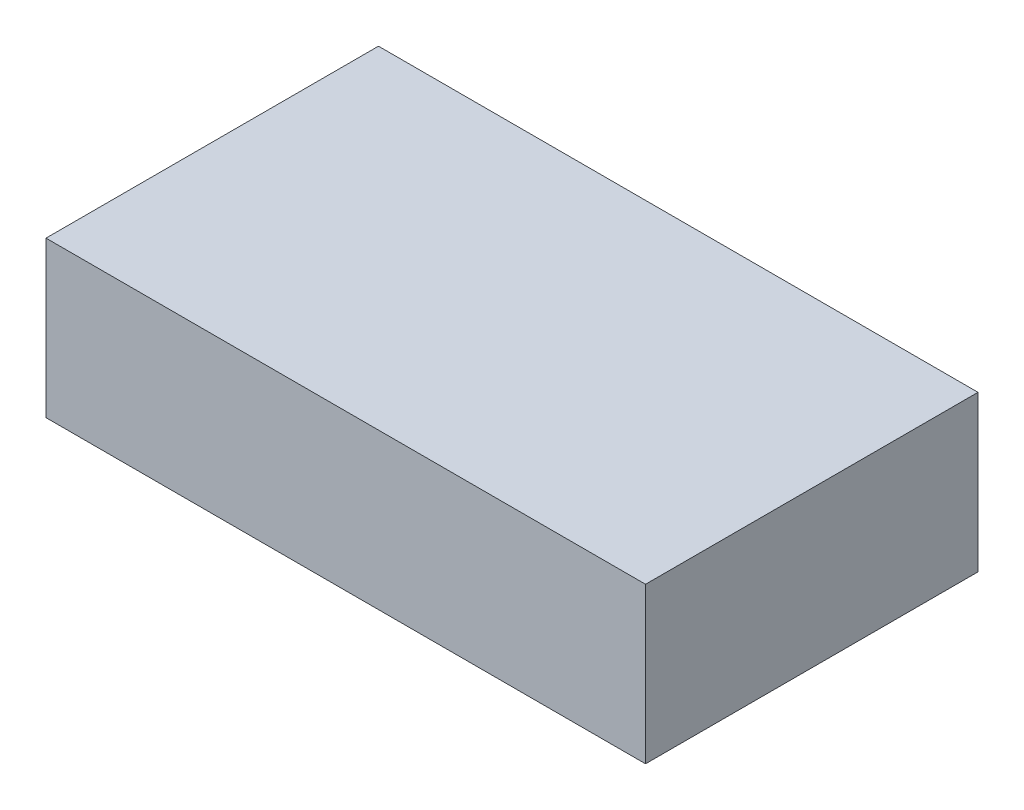
ISO-10303-21;
HEADER;
FILE_DESCRIPTION(('STEP AP214'),'2;1');
FILE_NAME('part.step','',(''),(''),'','','');
FILE_SCHEMA(('AUTOMOTIVE_DESIGN { 1 0 10303 214 1 1 1 1 }'));
ENDSEC;
DATA;
#1=APPLICATION_CONTEXT('core data for automotive mechanical design processes');
#2=APPLICATION_PROTOCOL_DEFINITION('international standard','automotive_design',2000,#1);
#3=PRODUCT_CONTEXT('',#1,'mechanical');
#4=PRODUCT('Part','Part','',(#3));
#5=PRODUCT_RELATED_PRODUCT_CATEGORY('part','',(#4));
#6=PRODUCT_DEFINITION_FORMATION('','',#4);
#7=PRODUCT_DEFINITION_CONTEXT('part definition',#1,'design');
#8=PRODUCT_DEFINITION('design','',#6,#7);
#9=PRODUCT_DEFINITION_SHAPE('','',#8);
#10=(LENGTH_UNIT() NAMED_UNIT(*) SI_UNIT(.MILLI.,.METRE.));
#11=(NAMED_UNIT(*) PLANE_ANGLE_UNIT() SI_UNIT($,.RADIAN.));
#12=(NAMED_UNIT(*) SI_UNIT($,.STERADIAN.) SOLID_ANGLE_UNIT());
#13=UNCERTAINTY_MEASURE_WITH_UNIT(LENGTH_MEASURE(1.E-05),#10,'distance_accuracy_value','');
#14=(GEOMETRIC_REPRESENTATION_CONTEXT(3) GLOBAL_UNCERTAINTY_ASSIGNED_CONTEXT((#13)) GLOBAL_UNIT_ASSIGNED_CONTEXT((#10,
#11,#12)) REPRESENTATION_CONTEXT('',''));
#15=CARTESIAN_POINT('',(0.,0.,0.));
#16=DIRECTION('',(0.,0.,1.));
#17=DIRECTION('',(1.,0.,0.));
#18=AXIS2_PLACEMENT_3D('',#15,#16,#17);
#19=CARTESIAN_POINT('',(-68.7035009924545,-17.8209785438174,76.2));
#20=DIRECTION('',(-1.,0.,0.));
#21=DIRECTION('',(0.,0.,1.));
#22=AXIS2_PLACEMENT_3D('',#19,#20,#21);
#23=PLANE('',#22);
#24=DIRECTION('',(0.,1.,0.));
#25=VECTOR('',#24,1.);
#26=CARTESIAN_POINT('',(-68.7035009924545,-17.8209785438174,0.));
#27=LINE('',#26,#25);
#28=CARTESIAN_POINT('',(-68.7035009924545,-17.8209785438174,0.));
#29=VERTEX_POINT('',#28);
#30=CARTESIAN_POINT('',(-68.7035009924545,17.8209785438174,0.));
#31=VERTEX_POINT('',#30);
#32=EDGE_CURVE('E98',#29,#31,#27,.T.);
#33=ORIENTED_EDGE('',*,*,#32,.F.);
#34=DIRECTION('',(0.,0.,-1.));
#35=VECTOR('',#34,1.);
#36=CARTESIAN_POINT('',(-68.7035009924545,-17.8209785438174,76.2));
#37=LINE('',#36,#35);
#38=CARTESIAN_POINT('',(-68.7035009924545,-17.8209785438174,76.2));
#39=VERTEX_POINT('',#38);
#40=EDGE_CURVE('E11',#39,#29,#37,.T.);
#41=ORIENTED_EDGE('',*,*,#40,.F.);
#42=DIRECTION('',(0.,1.,0.));
#43=VECTOR('',#42,1.);
#44=CARTESIAN_POINT('',(-68.7035009924545,-17.8209785438174,76.2));
#45=LINE('',#44,#43);
#46=CARTESIAN_POINT('',(-68.7035009924545,17.8209785438174,76.2));
#47=VERTEX_POINT('',#46);
#48=EDGE_CURVE('E93',#39,#47,#45,.T.);
#49=ORIENTED_EDGE('',*,*,#48,.T.);
#50=DIRECTION('',(0.,0.,-1.));
#51=VECTOR('',#50,1.);
#52=CARTESIAN_POINT('',(-68.7035009924545,17.8209785438174,76.2));
#53=LINE('',#52,#51);
#54=EDGE_CURVE('E36',#47,#31,#53,.T.);
#55=ORIENTED_EDGE('',*,*,#54,.T.);
#56=EDGE_LOOP('',(#33,#41,#49,#55));
#57=FACE_BOUND('',#56,.T.);
#58=ADVANCED_FACE('F33',(#57),#23,.T.);
#59=CARTESIAN_POINT('',(-68.7035009924545,-17.8209785438174,76.2));
#60=DIRECTION('',(0.,1.,0.));
#61=DIRECTION('',(0.,0.,1.));
#62=AXIS2_PLACEMENT_3D('',#59,#60,#61);
#63=PLANE('',#62);
#64=DIRECTION('',(1.,0.,0.));
#65=VECTOR('',#64,1.);
#66=CARTESIAN_POINT('',(-68.7035009924545,-17.8209785438174,0.));
#67=LINE('',#66,#65);
#68=CARTESIAN_POINT('',(68.7035009924545,-17.8209785438174,0.));
#69=VERTEX_POINT('',#68);
#70=EDGE_CURVE('E66',#29,#69,#67,.T.);
#71=ORIENTED_EDGE('',*,*,#70,.T.);
#72=DIRECTION('',(0.,0.,-1.));
#73=VECTOR('',#72,1.);
#74=CARTESIAN_POINT('',(68.7035009924545,-17.8209785438174,76.2));
#75=LINE('',#74,#73);
#76=CARTESIAN_POINT('',(68.7035009924545,-17.8209785438174,76.2));
#77=VERTEX_POINT('',#76);
#78=EDGE_CURVE('E42',#77,#69,#75,.T.);
#79=ORIENTED_EDGE('',*,*,#78,.F.);
#80=DIRECTION('',(1.,0.,0.));
#81=VECTOR('',#80,1.);
#82=CARTESIAN_POINT('',(-68.7035009924545,-17.8209785438174,76.2));
#83=LINE('',#82,#81);
#84=EDGE_CURVE('E83',#39,#77,#83,.T.);
#85=ORIENTED_EDGE('',*,*,#84,.F.);
#86=ORIENTED_EDGE('',*,*,#40,.T.);
#87=EDGE_LOOP('',(#71,#79,#85,#86));
#88=FACE_BOUND('',#87,.T.);
#89=ADVANCED_FACE('F108',(#88),#63,.F.);
#90=CARTESIAN_POINT('',(68.7035009924545,-17.8209785438174,76.2));
#91=DIRECTION('',(-1.,0.,0.));
#92=DIRECTION('',(0.,0.,1.));
#93=AXIS2_PLACEMENT_3D('',#90,#91,#92);
#94=PLANE('',#93);
#95=DIRECTION('',(0.,1.,0.));
#96=VECTOR('',#95,1.);
#97=CARTESIAN_POINT('',(68.7035009924545,-17.8209785438174,0.));
#98=LINE('',#97,#96);
#99=CARTESIAN_POINT('',(68.7035009924545,17.8209785438174,0.));
#100=VERTEX_POINT('',#99);
#101=EDGE_CURVE('E90',#69,#100,#98,.T.);
#102=ORIENTED_EDGE('',*,*,#101,.T.);
#103=DIRECTION('',(0.,0.,-1.));
#104=VECTOR('',#103,1.);
#105=CARTESIAN_POINT('',(68.7035009924545,17.8209785438174,76.2));
#106=LINE('',#105,#104);
#107=CARTESIAN_POINT('',(68.7035009924545,17.8209785438174,76.2));
#108=VERTEX_POINT('',#107);
#109=EDGE_CURVE('E87',#108,#100,#106,.T.);
#110=ORIENTED_EDGE('',*,*,#109,.F.);
#111=DIRECTION('',(0.,1.,0.));
#112=VECTOR('',#111,1.);
#113=CARTESIAN_POINT('',(68.7035009924545,-17.8209785438174,76.2));
#114=LINE('',#113,#112);
#115=EDGE_CURVE('E78',#77,#108,#114,.T.);
#116=ORIENTED_EDGE('',*,*,#115,.F.);
#117=ORIENTED_EDGE('',*,*,#78,.T.);
#118=EDGE_LOOP('',(#102,#110,#116,#117));
#119=FACE_BOUND('',#118,.T.);
#120=ADVANCED_FACE('F88',(#119),#94,.F.);
#121=CARTESIAN_POINT('',(-68.7035009924545,17.8209785438174,76.2));
#122=DIRECTION('',(0.,1.,0.));
#123=DIRECTION('',(0.,0.,1.));
#124=AXIS2_PLACEMENT_3D('',#121,#122,#123);
#125=PLANE('',#124);
#126=DIRECTION('',(1.,0.,0.));
#127=VECTOR('',#126,1.);
#128=CARTESIAN_POINT('',(-68.7035009924545,17.8209785438174,0.));
#129=LINE('',#128,#127);
#130=EDGE_CURVE('E101',#31,#100,#129,.T.);
#131=ORIENTED_EDGE('',*,*,#130,.F.);
#132=ORIENTED_EDGE('',*,*,#54,.F.);
#133=DIRECTION('',(1.,0.,0.));
#134=VECTOR('',#133,1.);
#135=CARTESIAN_POINT('',(-68.7035009924545,17.8209785438174,76.2));
#136=LINE('',#135,#134);
#137=EDGE_CURVE('E82',#47,#108,#136,.T.);
#138=ORIENTED_EDGE('',*,*,#137,.T.);
#139=ORIENTED_EDGE('',*,*,#109,.T.);
#140=EDGE_LOOP('',(#131,#132,#138,#139));
#141=FACE_BOUND('',#140,.T.);
#142=ADVANCED_FACE('F92',(#141),#125,.T.);
#143=CARTESIAN_POINT('',(0.,0.,76.2));
#144=DIRECTION('',(0.,0.,-1.));
#145=DIRECTION('',(-1.,0.,0.));
#146=AXIS2_PLACEMENT_3D('',#143,#144,#145);
#147=PLANE('',#146);
#148=ORIENTED_EDGE('',*,*,#48,.F.);
#149=ORIENTED_EDGE('',*,*,#84,.T.);
#150=ORIENTED_EDGE('',*,*,#115,.T.);
#151=ORIENTED_EDGE('',*,*,#137,.F.);
#152=EDGE_LOOP('',(#148,#149,#150,#151));
#153=FACE_BOUND('',#152,.T.);
#154=ADVANCED_FACE('F81',(#153),#147,.F.);
#155=CARTESIAN_POINT('',(0.,0.,0.));
#156=DIRECTION('',(0.,0.,-1.));
#157=DIRECTION('',(-1.,0.,0.));
#158=AXIS2_PLACEMENT_3D('',#155,#156,#157);
#159=PLANE('',#158);
#160=ORIENTED_EDGE('',*,*,#32,.T.);
#161=ORIENTED_EDGE('',*,*,#130,.T.);
#162=ORIENTED_EDGE('',*,*,#101,.F.);
#163=ORIENTED_EDGE('',*,*,#70,.F.);
#164=EDGE_LOOP('',(#160,#161,#162,#163));
#165=FACE_BOUND('',#164,.T.);
#166=ADVANCED_FACE('F106',(#165),#159,.T.);
#167=CLOSED_SHELL('',(#58,#89,#120,#142,#154,#166));
#168=MANIFOLD_SOLID_BREP('B2',#167);
#169=ADVANCED_BREP_SHAPE_REPRESENTATION('',(#18,#168),#14);
#170=SHAPE_DEFINITION_REPRESENTATION(#9,#169);
ENDSEC;
END-ISO-10303-21;
